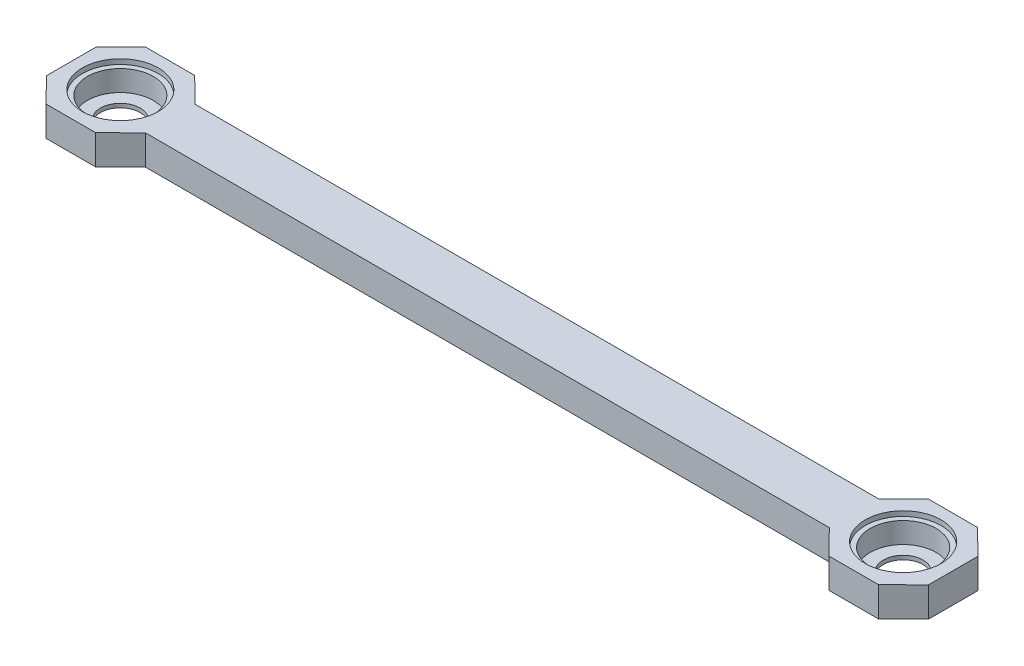
ISO-10303-21;
HEADER;
FILE_DESCRIPTION(('STEP AP214'),'2;1');
FILE_NAME('part.step','',(''),(''),'','','');
FILE_SCHEMA(('AUTOMOTIVE_DESIGN { 1 0 10303 214 1 1 1 1 }'));
ENDSEC;
DATA;
#1=APPLICATION_CONTEXT('core data for automotive mechanical design processes');
#2=APPLICATION_PROTOCOL_DEFINITION('international standard','automotive_design',2000,#1);
#3=PRODUCT_CONTEXT('',#1,'mechanical');
#4=PRODUCT('Part','Part','',(#3));
#5=PRODUCT_RELATED_PRODUCT_CATEGORY('part','',(#4));
#6=PRODUCT_DEFINITION_FORMATION('','',#4);
#7=PRODUCT_DEFINITION_CONTEXT('part definition',#1,'design');
#8=PRODUCT_DEFINITION('design','',#6,#7);
#9=PRODUCT_DEFINITION_SHAPE('','',#8);
#10=(LENGTH_UNIT() NAMED_UNIT(*) SI_UNIT(.MILLI.,.METRE.));
#11=(NAMED_UNIT(*) PLANE_ANGLE_UNIT() SI_UNIT($,.RADIAN.));
#12=(NAMED_UNIT(*) SI_UNIT($,.STERADIAN.) SOLID_ANGLE_UNIT());
#13=UNCERTAINTY_MEASURE_WITH_UNIT(LENGTH_MEASURE(1.E-05),#10,'distance_accuracy_value','');
#14=(GEOMETRIC_REPRESENTATION_CONTEXT(3) GLOBAL_UNCERTAINTY_ASSIGNED_CONTEXT((#13)) GLOBAL_UNIT_ASSIGNED_CONTEXT((#10,
#11,#12)) REPRESENTATION_CONTEXT('',''));
#15=CARTESIAN_POINT('',(0.,0.,0.));
#16=DIRECTION('',(0.,0.,1.));
#17=DIRECTION('',(1.,0.,0.));
#18=AXIS2_PLACEMENT_3D('',#15,#16,#17);
#19=CARTESIAN_POINT('',(82.6366555158427,0.8,0.));
#20=DIRECTION('',(0.,1.,0.));
#21=DIRECTION('',(0.,0.,1.));
#22=AXIS2_PLACEMENT_3D('',#19,#20,#21);
#23=CYLINDRICAL_SURFACE('',#22,6.65000000000001);
#24=CARTESIAN_POINT('',(82.6366555158427,0.8,0.));
#25=DIRECTION('',(0.,1.,0.));
#26=DIRECTION('',(0.,0.,1.));
#27=AXIS2_PLACEMENT_3D('',#24,#25,#26);
#28=CIRCLE('',#27,6.65000000000001);
#29=CARTESIAN_POINT('',(82.6366555158427,0.8,6.65000000000001));
#30=VERTEX_POINT('',#29);
#31=EDGE_CURVE('E253',#30,#30,#28,.T.);
#32=ORIENTED_EDGE('',*,*,#31,.F.);
#33=EDGE_LOOP('',(#32));
#34=FACE_BOUND('',#33,.T.);
#35=CARTESIAN_POINT('',(82.6366555158427,5.,0.));
#36=DIRECTION('',(0.,1.,0.));
#37=DIRECTION('',(0.,0.,1.));
#38=AXIS2_PLACEMENT_3D('',#35,#36,#37);
#39=CIRCLE('',#38,6.65000000000001);
#40=CARTESIAN_POINT('',(82.6366555158427,5.,6.65000000000001));
#41=VERTEX_POINT('',#40);
#42=EDGE_CURVE('E39',#41,#41,#39,.F.);
#43=ORIENTED_EDGE('',*,*,#42,.F.);
#44=EDGE_LOOP('',(#43));
#45=FACE_BOUND('',#44,.T.);
#46=ADVANCED_FACE('F35',(#34,#45),#23,.F.);
#47=CARTESIAN_POINT('',(-75.3633444841573,0.8,0.));
#48=DIRECTION('',(0.,1.,0.));
#49=DIRECTION('',(0.,0.,1.));
#50=AXIS2_PLACEMENT_3D('',#47,#48,#49);
#51=CYLINDRICAL_SURFACE('',#50,6.65000000000001);
#52=CARTESIAN_POINT('',(-75.3633444841573,0.8,0.));
#53=DIRECTION('',(0.,1.,0.));
#54=DIRECTION('',(0.,0.,1.));
#55=AXIS2_PLACEMENT_3D('',#52,#53,#54);
#56=CIRCLE('',#55,6.65000000000001);
#57=CARTESIAN_POINT('',(-75.3633444841573,0.8,6.65000000000001));
#58=VERTEX_POINT('',#57);
#59=EDGE_CURVE('E262',#58,#58,#56,.T.);
#60=ORIENTED_EDGE('',*,*,#59,.F.);
#61=EDGE_LOOP('',(#60));
#62=FACE_BOUND('',#61,.T.);
#63=CARTESIAN_POINT('',(-75.3633444841573,5.,0.));
#64=DIRECTION('',(0.,1.,0.));
#65=DIRECTION('',(0.,0.,1.));
#66=AXIS2_PLACEMENT_3D('',#63,#64,#65);
#67=CIRCLE('',#66,6.65000000000001);
#68=CARTESIAN_POINT('',(-75.3633444841573,5.,6.65000000000001));
#69=VERTEX_POINT('',#68);
#70=EDGE_CURVE('E256',#69,#69,#67,.F.);
#71=ORIENTED_EDGE('',*,*,#70,.F.);
#72=EDGE_LOOP('',(#71));
#73=FACE_BOUND('',#72,.T.);
#74=ADVANCED_FACE('F338',(#62,#73),#51,.F.);
#75=CARTESIAN_POINT('',(-75.3633444841573,6.,0.));
#76=DIRECTION('',(0.,-1.,0.));
#77=DIRECTION('',(0.,0.,-1.));
#78=AXIS2_PLACEMENT_3D('',#75,#76,#77);
#79=CYLINDRICAL_SURFACE('',#78,4.00000000000001);
#80=CARTESIAN_POINT('',(-75.3633444841573,0.,0.));
#81=DIRECTION('',(0.,1.,0.));
#82=DIRECTION('',(0.,0.,1.));
#83=AXIS2_PLACEMENT_3D('',#80,#81,#82);
#84=CIRCLE('',#83,4.00000000000001);
#85=CARTESIAN_POINT('',(-75.3633444841573,0.,4.00000000000001));
#86=VERTEX_POINT('',#85);
#87=EDGE_CURVE('E186',#86,#86,#84,.T.);
#88=ORIENTED_EDGE('',*,*,#87,.F.);
#89=EDGE_LOOP('',(#88));
#90=FACE_BOUND('',#89,.T.);
#91=CARTESIAN_POINT('',(-75.3633444841573,0.8,0.));
#92=DIRECTION('',(0.,1.,0.));
#93=DIRECTION('',(0.,0.,1.));
#94=AXIS2_PLACEMENT_3D('',#91,#92,#93);
#95=CIRCLE('',#94,4.00000000000001);
#96=CARTESIAN_POINT('',(-75.3633444841573,0.8,4.00000000000001));
#97=VERTEX_POINT('',#96);
#98=EDGE_CURVE('E252',#97,#97,#95,.T.);
#99=ORIENTED_EDGE('',*,*,#98,.T.);
#100=EDGE_LOOP('',(#99));
#101=FACE_BOUND('',#100,.T.);
#102=ADVANCED_FACE('F344',(#90,#101),#79,.F.);
#103=CARTESIAN_POINT('',(82.6366555158427,6.,0.));
#104=DIRECTION('',(0.,-1.,0.));
#105=DIRECTION('',(0.,0.,-1.));
#106=AXIS2_PLACEMENT_3D('',#103,#104,#105);
#107=CYLINDRICAL_SURFACE('',#106,4.00000000000001);
#108=CARTESIAN_POINT('',(82.6366555158427,0.,0.));
#109=DIRECTION('',(0.,1.,0.));
#110=DIRECTION('',(0.,0.,1.));
#111=AXIS2_PLACEMENT_3D('',#108,#109,#110);
#112=CIRCLE('',#111,4.00000000000001);
#113=CARTESIAN_POINT('',(82.6366555158427,0.,4.00000000000001));
#114=VERTEX_POINT('',#113);
#115=EDGE_CURVE('E255',#114,#114,#112,.T.);
#116=ORIENTED_EDGE('',*,*,#115,.F.);
#117=EDGE_LOOP('',(#116));
#118=FACE_BOUND('',#117,.T.);
#119=CARTESIAN_POINT('',(82.6366555158427,0.8,0.));
#120=DIRECTION('',(0.,1.,0.));
#121=DIRECTION('',(0.,0.,1.));
#122=AXIS2_PLACEMENT_3D('',#119,#120,#121);
#123=CIRCLE('',#122,4.00000000000001);
#124=CARTESIAN_POINT('',(82.6366555158427,0.8,4.00000000000001));
#125=VERTEX_POINT('',#124);
#126=EDGE_CURVE('E249',#125,#125,#123,.T.);
#127=ORIENTED_EDGE('',*,*,#126,.T.);
#128=EDGE_LOOP('',(#127));
#129=FACE_BOUND('',#128,.T.);
#130=ADVANCED_FACE('F355',(#118,#129),#107,.F.);
#131=CARTESIAN_POINT('',(0.,6.,0.));
#132=DIRECTION('',(0.,-1.,0.));
#133=DIRECTION('',(0.,0.,-1.));
#134=AXIS2_PLACEMENT_3D('',#131,#132,#133);
#135=PLANE('',#134);
#136=CARTESIAN_POINT('',(82.6366555158427,6.,0.));
#137=DIRECTION('',(0.,1.,0.));
#138=DIRECTION('',(0.,0.,1.));
#139=AXIS2_PLACEMENT_3D('',#136,#137,#138);
#140=CIRCLE('',#139,7.65);
#141=CARTESIAN_POINT('',(82.6366555158427,6.,7.65));
#142=VERTEX_POINT('',#141);
#143=EDGE_CURVE('E264',#142,#142,#140,.T.);
#144=ORIENTED_EDGE('',*,*,#143,.F.);
#145=EDGE_LOOP('',(#144));
#146=FACE_BOUND('',#145,.T.);
#147=CARTESIAN_POINT('',(-75.3633444841573,6.,0.));
#148=DIRECTION('',(0.,1.,0.));
#149=DIRECTION('',(0.,0.,1.));
#150=AXIS2_PLACEMENT_3D('',#147,#148,#149);
#151=CIRCLE('',#150,7.65);
#152=CARTESIAN_POINT('',(-75.3633444841573,6.,7.65));
#153=VERTEX_POINT('',#152);
#154=EDGE_CURVE('E274',#153,#153,#151,.T.);
#155=ORIENTED_EDGE('',*,*,#154,.F.);
#156=EDGE_LOOP('',(#155));
#157=FACE_BOUND('',#156,.T.);
#158=DIRECTION('',(-1.,0.,0.));
#159=VECTOR('',#158,1.);
#160=CARTESIAN_POINT('',(-65.2623239697237,6.,-5.));
#161=LINE('',#160,#159);
#162=CARTESIAN_POINT('',(72.7376760302763,6.,-5.));
#163=VERTEX_POINT('',#162);
#164=CARTESIAN_POINT('',(-65.2623239697237,6.,-5.));
#165=VERTEX_POINT('',#164);
#166=EDGE_CURVE('E213',#163,#165,#161,.T.);
#167=ORIENTED_EDGE('',*,*,#166,.T.);
#168=DIRECTION('',(-0.714142857145833,0.,-0.699999985419705));
#169=VECTOR('',#168,1.);
#170=CARTESIAN_POINT('',(-65.2623239697237,6.,-5.));
#171=LINE('',#170,#169);
#172=CARTESIAN_POINT('',(-70.3633444841573,6.,-10.));
#173=VERTEX_POINT('',#172);
#174=EDGE_CURVE('E121',#165,#173,#171,.T.);
#175=ORIENTED_EDGE('',*,*,#174,.T.);
#176=DIRECTION('',(-1.,0.,0.));
#177=VECTOR('',#176,1.);
#178=CARTESIAN_POINT('',(-70.3633444841573,6.,-10.));
#179=LINE('',#178,#177);
#180=CARTESIAN_POINT('',(-80.3633444841573,6.,-10.));
#181=VERTEX_POINT('',#180);
#182=EDGE_CURVE('E287',#173,#181,#179,.T.);
#183=ORIENTED_EDGE('',*,*,#182,.T.);
#184=DIRECTION('',(-0.699854212223766,0.,0.714285714285714));
#185=VECTOR('',#184,1.);
#186=CARTESIAN_POINT('',(-80.3633444841573,6.,-10.));
#187=LINE('',#186,#185);
#188=CARTESIAN_POINT('',(-85.2623239697237,6.,-5.));
#189=VERTEX_POINT('',#188);
#190=EDGE_CURVE('E289',#181,#189,#187,.T.);
#191=ORIENTED_EDGE('',*,*,#190,.T.);
#192=DIRECTION('',(0.,0.,1.));
#193=VECTOR('',#192,1.);
#194=CARTESIAN_POINT('',(-85.2623239697237,6.,-5.));
#195=LINE('',#194,#193);
#196=CARTESIAN_POINT('',(-85.2623239697237,6.,5.));
#197=VERTEX_POINT('',#196);
#198=EDGE_CURVE('E291',#189,#197,#195,.T.);
#199=ORIENTED_EDGE('',*,*,#198,.T.);
#200=DIRECTION('',(0.699854212223765,0.,0.714285714285715));
#201=VECTOR('',#200,1.);
#202=CARTESIAN_POINT('',(-80.3633444841573,6.,10.));
#203=LINE('',#202,#201);
#204=CARTESIAN_POINT('',(-80.3633444841573,6.,10.));
#205=VERTEX_POINT('',#204);
#206=EDGE_CURVE('E293',#197,#205,#203,.T.);
#207=ORIENTED_EDGE('',*,*,#206,.T.);
#208=DIRECTION('',(1.,0.,0.));
#209=VECTOR('',#208,1.);
#210=CARTESIAN_POINT('',(-70.3633444841573,6.,10.));
#211=LINE('',#210,#209);
#212=CARTESIAN_POINT('',(-70.3633444841573,6.,10.));
#213=VERTEX_POINT('',#212);
#214=EDGE_CURVE('E295',#205,#213,#211,.T.);
#215=ORIENTED_EDGE('',*,*,#214,.T.);
#216=DIRECTION('',(0.714142857145833,0.,-0.699999985419705));
#217=VECTOR('',#216,1.);
#218=CARTESIAN_POINT('',(-65.2623239697237,6.,5.));
#219=LINE('',#218,#217);
#220=CARTESIAN_POINT('',(-65.2623239697237,6.,5.));
#221=VERTEX_POINT('',#220);
#222=EDGE_CURVE('E297',#213,#221,#219,.T.);
#223=ORIENTED_EDGE('',*,*,#222,.T.);
#224=DIRECTION('',(1.,0.,0.));
#225=VECTOR('',#224,1.);
#226=CARTESIAN_POINT('',(72.7376760302763,6.,5.));
#227=LINE('',#226,#225);
#228=CARTESIAN_POINT('',(72.7376760302763,6.,5.));
#229=VERTEX_POINT('',#228);
#230=EDGE_CURVE('E299',#221,#229,#227,.T.);
#231=ORIENTED_EDGE('',*,*,#230,.T.);
#232=DIRECTION('',(0.699854212223766,0.,0.714285714285714));
#233=VECTOR('',#232,1.);
#234=CARTESIAN_POINT('',(72.7376760302763,6.,5.));
#235=LINE('',#234,#233);
#236=CARTESIAN_POINT('',(77.6366555158427,6.,10.));
#237=VERTEX_POINT('',#236);
#238=EDGE_CURVE('E301',#229,#237,#235,.T.);
#239=ORIENTED_EDGE('',*,*,#238,.T.);
#240=DIRECTION('',(1.,0.,0.));
#241=VECTOR('',#240,1.);
#242=CARTESIAN_POINT('',(77.6366555158427,6.,10.));
#243=LINE('',#242,#241);
#244=CARTESIAN_POINT('',(87.6366555158427,6.,10.));
#245=VERTEX_POINT('',#244);
#246=EDGE_CURVE('E303',#237,#245,#243,.T.);
#247=ORIENTED_EDGE('',*,*,#246,.T.);
#248=DIRECTION('',(0.714285714285714,0.,-0.699854212223765));
#249=VECTOR('',#248,1.);
#250=CARTESIAN_POINT('',(87.6366555158427,6.,10.));
#251=LINE('',#250,#249);
#252=CARTESIAN_POINT('',(92.739759146641,6.,5.));
#253=VERTEX_POINT('',#252);
#254=EDGE_CURVE('E305',#245,#253,#251,.T.);
#255=ORIENTED_EDGE('',*,*,#254,.T.);
#256=DIRECTION('',(0.,0.,-1.));
#257=VECTOR('',#256,1.);
#258=CARTESIAN_POINT('',(92.739759146641,6.,-5.));
#259=LINE('',#258,#257);
#260=CARTESIAN_POINT('',(92.739759146641,6.,-5.));
#261=VERTEX_POINT('',#260);
#262=EDGE_CURVE('E164',#253,#261,#259,.T.);
#263=ORIENTED_EDGE('',*,*,#262,.T.);
#264=DIRECTION('',(-0.714285714285714,0.,-0.699854212223765));
#265=VECTOR('',#264,1.);
#266=CARTESIAN_POINT('',(87.6366555158427,6.,-10.));
#267=LINE('',#266,#265);
#268=CARTESIAN_POINT('',(87.6366555158427,6.,-10.));
#269=VERTEX_POINT('',#268);
#270=EDGE_CURVE('E158',#261,#269,#267,.T.);
#271=ORIENTED_EDGE('',*,*,#270,.T.);
#272=DIRECTION('',(-1.,0.,0.));
#273=VECTOR('',#272,1.);
#274=CARTESIAN_POINT('',(77.6366555158427,6.,-10.));
#275=LINE('',#274,#273);
#276=CARTESIAN_POINT('',(77.6366555158427,6.,-10.));
#277=VERTEX_POINT('',#276);
#278=EDGE_CURVE('E162',#269,#277,#275,.T.);
#279=ORIENTED_EDGE('',*,*,#278,.T.);
#280=DIRECTION('',(-0.699854212223766,0.,0.714285714285714));
#281=VECTOR('',#280,1.);
#282=CARTESIAN_POINT('',(72.7376760302763,6.,-5.));
#283=LINE('',#282,#281);
#284=EDGE_CURVE('E54',#277,#163,#283,.T.);
#285=ORIENTED_EDGE('',*,*,#284,.T.);
#286=EDGE_LOOP('',(#167,#175,#183,#191,#199,#207,#215,#223,#231,#239,#247,#255,#263,#271,#279,#285));
#287=FACE_BOUND('',#286,.T.);
#288=ADVANCED_FACE('F160',(#146,#157,#287),#135,.F.);
#289=CARTESIAN_POINT('',(0.,0.,0.));
#290=DIRECTION('',(0.,-1.,0.));
#291=DIRECTION('',(0.,0.,-1.));
#292=AXIS2_PLACEMENT_3D('',#289,#290,#291);
#293=PLANE('',#292);
#294=ORIENTED_EDGE('',*,*,#87,.T.);
#295=EDGE_LOOP('',(#294));
#296=FACE_BOUND('',#295,.T.);
#297=DIRECTION('',(-1.,0.,0.));
#298=VECTOR('',#297,1.);
#299=CARTESIAN_POINT('',(-65.2623239697237,0.,-5.));
#300=LINE('',#299,#298);
#301=CARTESIAN_POINT('',(72.7376760302763,0.,-5.));
#302=VERTEX_POINT('',#301);
#303=CARTESIAN_POINT('',(-65.2623239697237,0.,-5.));
#304=VERTEX_POINT('',#303);
#305=EDGE_CURVE('E182',#302,#304,#300,.T.);
#306=ORIENTED_EDGE('',*,*,#305,.F.);
#307=DIRECTION('',(-0.699854212223766,0.,0.714285714285714));
#308=VECTOR('',#307,1.);
#309=CARTESIAN_POINT('',(72.7376760302763,0.,-5.));
#310=LINE('',#309,#308);
#311=CARTESIAN_POINT('',(77.6366555158427,0.,-10.));
#312=VERTEX_POINT('',#311);
#313=EDGE_CURVE('E113',#312,#302,#310,.T.);
#314=ORIENTED_EDGE('',*,*,#313,.F.);
#315=DIRECTION('',(-1.,0.,0.));
#316=VECTOR('',#315,1.);
#317=CARTESIAN_POINT('',(77.6366555158427,0.,-10.));
#318=LINE('',#317,#316);
#319=CARTESIAN_POINT('',(87.6366555158427,0.,-10.));
#320=VERTEX_POINT('',#319);
#321=EDGE_CURVE('E107',#320,#312,#318,.T.);
#322=ORIENTED_EDGE('',*,*,#321,.F.);
#323=DIRECTION('',(-0.714285714285714,0.,-0.699854212223765));
#324=VECTOR('',#323,1.);
#325=CARTESIAN_POINT('',(87.6366555158427,0.,-10.));
#326=LINE('',#325,#324);
#327=CARTESIAN_POINT('',(92.739759146641,0.,-5.));
#328=VERTEX_POINT('',#327);
#329=EDGE_CURVE('E172',#328,#320,#326,.T.);
#330=ORIENTED_EDGE('',*,*,#329,.F.);
#331=DIRECTION('',(0.,0.,-1.));
#332=VECTOR('',#331,1.);
#333=CARTESIAN_POINT('',(92.739759146641,0.,-5.));
#334=LINE('',#333,#332);
#335=CARTESIAN_POINT('',(92.739759146641,0.,5.));
#336=VERTEX_POINT('',#335);
#337=EDGE_CURVE('E208',#336,#328,#334,.T.);
#338=ORIENTED_EDGE('',*,*,#337,.F.);
#339=DIRECTION('',(0.714285714285714,0.,-0.699854212223765));
#340=VECTOR('',#339,1.);
#341=CARTESIAN_POINT('',(87.6366555158427,0.,10.));
#342=LINE('',#341,#340);
#343=CARTESIAN_POINT('',(87.6366555158427,0.,10.));
#344=VERTEX_POINT('',#343);
#345=EDGE_CURVE('E206',#344,#336,#342,.T.);
#346=ORIENTED_EDGE('',*,*,#345,.F.);
#347=DIRECTION('',(1.,0.,0.));
#348=VECTOR('',#347,1.);
#349=CARTESIAN_POINT('',(77.6366555158427,0.,10.));
#350=LINE('',#349,#348);
#351=CARTESIAN_POINT('',(77.6366555158427,0.,10.));
#352=VERTEX_POINT('',#351);
#353=EDGE_CURVE('E204',#352,#344,#350,.T.);
#354=ORIENTED_EDGE('',*,*,#353,.F.);
#355=DIRECTION('',(0.699854212223766,0.,0.714285714285714));
#356=VECTOR('',#355,1.);
#357=CARTESIAN_POINT('',(72.7376760302763,0.,5.));
#358=LINE('',#357,#356);
#359=CARTESIAN_POINT('',(72.7376760302763,0.,5.));
#360=VERTEX_POINT('',#359);
#361=EDGE_CURVE('E202',#360,#352,#358,.T.);
#362=ORIENTED_EDGE('',*,*,#361,.F.);
#363=DIRECTION('',(1.,0.,0.));
#364=VECTOR('',#363,1.);
#365=CARTESIAN_POINT('',(72.7376760302763,0.,5.));
#366=LINE('',#365,#364);
#367=CARTESIAN_POINT('',(-65.2623239697237,0.,5.));
#368=VERTEX_POINT('',#367);
#369=EDGE_CURVE('E200',#368,#360,#366,.T.);
#370=ORIENTED_EDGE('',*,*,#369,.F.);
#371=DIRECTION('',(0.714142857145833,0.,-0.699999985419705));
#372=VECTOR('',#371,1.);
#373=CARTESIAN_POINT('',(-65.2623239697237,0.,5.));
#374=LINE('',#373,#372);
#375=CARTESIAN_POINT('',(-70.3633444841573,0.,10.));
#376=VERTEX_POINT('',#375);
#377=EDGE_CURVE('E198',#376,#368,#374,.T.);
#378=ORIENTED_EDGE('',*,*,#377,.F.);
#379=DIRECTION('',(1.,0.,0.));
#380=VECTOR('',#379,1.);
#381=CARTESIAN_POINT('',(-70.3633444841573,0.,10.));
#382=LINE('',#381,#380);
#383=CARTESIAN_POINT('',(-80.3633444841573,0.,10.));
#384=VERTEX_POINT('',#383);
#385=EDGE_CURVE('E196',#384,#376,#382,.T.);
#386=ORIENTED_EDGE('',*,*,#385,.F.);
#387=DIRECTION('',(0.699854212223765,0.,0.714285714285715));
#388=VECTOR('',#387,1.);
#389=CARTESIAN_POINT('',(-80.3633444841573,0.,10.));
#390=LINE('',#389,#388);
#391=CARTESIAN_POINT('',(-85.2623239697237,0.,5.));
#392=VERTEX_POINT('',#391);
#393=EDGE_CURVE('E194',#392,#384,#390,.T.);
#394=ORIENTED_EDGE('',*,*,#393,.F.);
#395=DIRECTION('',(0.,0.,1.));
#396=VECTOR('',#395,1.);
#397=CARTESIAN_POINT('',(-85.2623239697237,0.,-5.));
#398=LINE('',#397,#396);
#399=CARTESIAN_POINT('',(-85.2623239697237,0.,-5.));
#400=VERTEX_POINT('',#399);
#401=EDGE_CURVE('E192',#400,#392,#398,.T.);
#402=ORIENTED_EDGE('',*,*,#401,.F.);
#403=DIRECTION('',(-0.699854212223766,0.,0.714285714285714));
#404=VECTOR('',#403,1.);
#405=CARTESIAN_POINT('',(-80.3633444841573,0.,-10.));
#406=LINE('',#405,#404);
#407=CARTESIAN_POINT('',(-80.3633444841573,0.,-10.));
#408=VERTEX_POINT('',#407);
#409=EDGE_CURVE('E190',#408,#400,#406,.T.);
#410=ORIENTED_EDGE('',*,*,#409,.F.);
#411=DIRECTION('',(-1.,0.,0.));
#412=VECTOR('',#411,1.);
#413=CARTESIAN_POINT('',(-70.3633444841573,0.,-10.));
#414=LINE('',#413,#412);
#415=CARTESIAN_POINT('',(-70.3633444841573,0.,-10.));
#416=VERTEX_POINT('',#415);
#417=EDGE_CURVE('E188',#416,#408,#414,.T.);
#418=ORIENTED_EDGE('',*,*,#417,.F.);
#419=DIRECTION('',(-0.714142857145833,0.,-0.699999985419705));
#420=VECTOR('',#419,1.);
#421=CARTESIAN_POINT('',(-65.2623239697237,0.,-5.));
#422=LINE('',#421,#420);
#423=EDGE_CURVE('E185',#304,#416,#422,.T.);
#424=ORIENTED_EDGE('',*,*,#423,.F.);
#425=EDGE_LOOP('',(#306,#314,#322,#330,#338,#346,#354,#362,#370,#378,#386,#394,#402,#410,#418,#424));
#426=FACE_BOUND('',#425,.T.);
#427=ORIENTED_EDGE('',*,*,#115,.T.);
#428=EDGE_LOOP('',(#427));
#429=FACE_BOUND('',#428,.T.);
#430=ADVANCED_FACE('F318',(#296,#426,#429),#293,.T.);
#431=CARTESIAN_POINT('',(-65.2623239697237,6.,-5.));
#432=DIRECTION('',(0.,0.,1.));
#433=DIRECTION('',(1.,0.,0.));
#434=AXIS2_PLACEMENT_3D('',#431,#432,#433);
#435=PLANE('',#434);
#436=ORIENTED_EDGE('',*,*,#305,.T.);
#437=DIRECTION('',(0.,-1.,0.));
#438=VECTOR('',#437,1.);
#439=CARTESIAN_POINT('',(-65.2623239697237,6.,-5.));
#440=LINE('',#439,#438);
#441=EDGE_CURVE('E11',#165,#304,#440,.T.);
#442=ORIENTED_EDGE('',*,*,#441,.F.);
#443=ORIENTED_EDGE('',*,*,#166,.F.);
#444=DIRECTION('',(0.,-1.,0.));
#445=VECTOR('',#444,1.);
#446=CARTESIAN_POINT('',(72.7376760302763,6.,-5.));
#447=LINE('',#446,#445);
#448=EDGE_CURVE('E178',#163,#302,#447,.T.);
#449=ORIENTED_EDGE('',*,*,#448,.T.);
#450=EDGE_LOOP('',(#436,#442,#443,#449));
#451=FACE_BOUND('',#450,.T.);
#452=ADVANCED_FACE('F37',(#451),#435,.F.);
#453=CARTESIAN_POINT('',(-65.2623239697237,6.,-5.));
#454=DIRECTION('',(-0.699999985419705,0.,0.714142857145833));
#455=DIRECTION('',(0.714142857145833,0.,0.699999985419705));
#456=AXIS2_PLACEMENT_3D('',#453,#454,#455);
#457=PLANE('',#456);
#458=ORIENTED_EDGE('',*,*,#423,.T.);
#459=DIRECTION('',(0.,-1.,0.));
#460=VECTOR('',#459,1.);
#461=CARTESIAN_POINT('',(-70.3633444841573,6.,-10.));
#462=LINE('',#461,#460);
#463=EDGE_CURVE('E45',#173,#416,#462,.T.);
#464=ORIENTED_EDGE('',*,*,#463,.F.);
#465=ORIENTED_EDGE('',*,*,#174,.F.);
#466=ORIENTED_EDGE('',*,*,#441,.T.);
#467=EDGE_LOOP('',(#458,#464,#465,#466));
#468=FACE_BOUND('',#467,.T.);
#469=ADVANCED_FACE('F369',(#468),#457,.F.);
#470=CARTESIAN_POINT('',(-70.3633444841573,6.,-10.));
#471=DIRECTION('',(0.,0.,1.));
#472=DIRECTION('',(1.,0.,0.));
#473=AXIS2_PLACEMENT_3D('',#470,#471,#472);
#474=PLANE('',#473);
#475=ORIENTED_EDGE('',*,*,#417,.T.);
#476=DIRECTION('',(0.,-1.,0.));
#477=VECTOR('',#476,1.);
#478=CARTESIAN_POINT('',(-80.3633444841573,6.,-10.));
#479=LINE('',#478,#477);
#480=EDGE_CURVE('E244',#181,#408,#479,.T.);
#481=ORIENTED_EDGE('',*,*,#480,.F.);
#482=ORIENTED_EDGE('',*,*,#182,.F.);
#483=ORIENTED_EDGE('',*,*,#463,.T.);
#484=EDGE_LOOP('',(#475,#481,#482,#483));
#485=FACE_BOUND('',#484,.T.);
#486=ADVANCED_FACE('F379',(#485),#474,.F.);
#487=CARTESIAN_POINT('',(-80.3633444841573,6.,-10.));
#488=DIRECTION('',(0.714285714285714,0.,0.699854212223766));
#489=DIRECTION('',(0.699854212223766,0.,-0.714285714285714));
#490=AXIS2_PLACEMENT_3D('',#487,#488,#489);
#491=PLANE('',#490);
#492=ORIENTED_EDGE('',*,*,#409,.T.);
#493=DIRECTION('',(0.,-1.,0.));
#494=VECTOR('',#493,1.);
#495=CARTESIAN_POINT('',(-85.2623239697237,6.,-5.));
#496=LINE('',#495,#494);
#497=EDGE_CURVE('E241',#189,#400,#496,.T.);
#498=ORIENTED_EDGE('',*,*,#497,.F.);
#499=ORIENTED_EDGE('',*,*,#190,.F.);
#500=ORIENTED_EDGE('',*,*,#480,.T.);
#501=EDGE_LOOP('',(#492,#498,#499,#500));
#502=FACE_BOUND('',#501,.T.);
#503=ADVANCED_FACE('F383',(#502),#491,.F.);
#504=CARTESIAN_POINT('',(-85.2623239697237,6.,-5.));
#505=DIRECTION('',(1.,0.,0.));
#506=DIRECTION('',(0.,0.,-1.));
#507=AXIS2_PLACEMENT_3D('',#504,#505,#506);
#508=PLANE('',#507);
#509=ORIENTED_EDGE('',*,*,#401,.T.);
#510=DIRECTION('',(0.,-1.,0.));
#511=VECTOR('',#510,1.);
#512=CARTESIAN_POINT('',(-85.2623239697237,6.,5.));
#513=LINE('',#512,#511);
#514=EDGE_CURVE('E238',#197,#392,#513,.T.);
#515=ORIENTED_EDGE('',*,*,#514,.F.);
#516=ORIENTED_EDGE('',*,*,#198,.F.);
#517=ORIENTED_EDGE('',*,*,#497,.T.);
#518=EDGE_LOOP('',(#509,#515,#516,#517));
#519=FACE_BOUND('',#518,.T.);
#520=ADVANCED_FACE('F389',(#519),#508,.F.);
#521=CARTESIAN_POINT('',(-80.3633444841573,6.,10.));
#522=DIRECTION('',(0.714285714285715,0.,-0.699854212223764));
#523=DIRECTION('',(-0.699854212223764,0.,-0.714285714285715));
#524=AXIS2_PLACEMENT_3D('',#521,#522,#523);
#525=PLANE('',#524);
#526=ORIENTED_EDGE('',*,*,#393,.T.);
#527=DIRECTION('',(0.,-1.,0.));
#528=VECTOR('',#527,1.);
#529=CARTESIAN_POINT('',(-80.3633444841573,6.,10.));
#530=LINE('',#529,#528);
#531=EDGE_CURVE('E235',#205,#384,#530,.T.);
#532=ORIENTED_EDGE('',*,*,#531,.F.);
#533=ORIENTED_EDGE('',*,*,#206,.F.);
#534=ORIENTED_EDGE('',*,*,#514,.T.);
#535=EDGE_LOOP('',(#526,#532,#533,#534));
#536=FACE_BOUND('',#535,.T.);
#537=ADVANCED_FACE('F393',(#536),#525,.F.);
#538=CARTESIAN_POINT('',(-70.3633444841573,6.,10.));
#539=DIRECTION('',(0.,0.,-1.));
#540=DIRECTION('',(-1.,0.,0.));
#541=AXIS2_PLACEMENT_3D('',#538,#539,#540);
#542=PLANE('',#541);
#543=ORIENTED_EDGE('',*,*,#385,.T.);
#544=DIRECTION('',(0.,-1.,0.));
#545=VECTOR('',#544,1.);
#546=CARTESIAN_POINT('',(-70.3633444841573,6.,10.));
#547=LINE('',#546,#545);
#548=EDGE_CURVE('E232',#213,#376,#547,.T.);
#549=ORIENTED_EDGE('',*,*,#548,.F.);
#550=ORIENTED_EDGE('',*,*,#214,.F.);
#551=ORIENTED_EDGE('',*,*,#531,.T.);
#552=EDGE_LOOP('',(#543,#549,#550,#551));
#553=FACE_BOUND('',#552,.T.);
#554=ADVANCED_FACE('F397',(#553),#542,.F.);
#555=CARTESIAN_POINT('',(-65.2623239697237,6.,5.));
#556=DIRECTION('',(-0.699999985419705,0.,-0.714142857145833));
#557=DIRECTION('',(-0.714142857145833,0.,0.699999985419705));
#558=AXIS2_PLACEMENT_3D('',#555,#556,#557);
#559=PLANE('',#558);
#560=ORIENTED_EDGE('',*,*,#377,.T.);
#561=DIRECTION('',(0.,-1.,0.));
#562=VECTOR('',#561,1.);
#563=CARTESIAN_POINT('',(-65.2623239697237,6.,5.));
#564=LINE('',#563,#562);
#565=EDGE_CURVE('E229',#221,#368,#564,.T.);
#566=ORIENTED_EDGE('',*,*,#565,.F.);
#567=ORIENTED_EDGE('',*,*,#222,.F.);
#568=ORIENTED_EDGE('',*,*,#548,.T.);
#569=EDGE_LOOP('',(#560,#566,#567,#568));
#570=FACE_BOUND('',#569,.T.);
#571=ADVANCED_FACE('F401',(#570),#559,.F.);
#572=CARTESIAN_POINT('',(72.7376760302763,6.,5.));
#573=DIRECTION('',(0.,0.,-1.));
#574=DIRECTION('',(-1.,0.,0.));
#575=AXIS2_PLACEMENT_3D('',#572,#573,#574);
#576=PLANE('',#575);
#577=ORIENTED_EDGE('',*,*,#369,.T.);
#578=DIRECTION('',(0.,-1.,0.));
#579=VECTOR('',#578,1.);
#580=CARTESIAN_POINT('',(72.7376760302763,6.,5.));
#581=LINE('',#580,#579);
#582=EDGE_CURVE('E226',#229,#360,#581,.T.);
#583=ORIENTED_EDGE('',*,*,#582,.F.);
#584=ORIENTED_EDGE('',*,*,#230,.F.);
#585=ORIENTED_EDGE('',*,*,#565,.T.);
#586=EDGE_LOOP('',(#577,#583,#584,#585));
#587=FACE_BOUND('',#586,.T.);
#588=ADVANCED_FACE('F405',(#587),#576,.F.);
#589=CARTESIAN_POINT('',(72.7376760302763,6.,5.));
#590=DIRECTION('',(0.714285714285714,0.,-0.699854212223766));
#591=DIRECTION('',(-0.699854212223766,0.,-0.714285714285714));
#592=AXIS2_PLACEMENT_3D('',#589,#590,#591);
#593=PLANE('',#592);
#594=ORIENTED_EDGE('',*,*,#361,.T.);
#595=DIRECTION('',(0.,-1.,0.));
#596=VECTOR('',#595,1.);
#597=CARTESIAN_POINT('',(77.6366555158427,6.,10.));
#598=LINE('',#597,#596);
#599=EDGE_CURVE('E223',#237,#352,#598,.T.);
#600=ORIENTED_EDGE('',*,*,#599,.F.);
#601=ORIENTED_EDGE('',*,*,#238,.F.);
#602=ORIENTED_EDGE('',*,*,#582,.T.);
#603=EDGE_LOOP('',(#594,#600,#601,#602));
#604=FACE_BOUND('',#603,.T.);
#605=ADVANCED_FACE('F409',(#604),#593,.F.);
#606=CARTESIAN_POINT('',(77.6366555158427,6.,10.));
#607=DIRECTION('',(0.,0.,-1.));
#608=DIRECTION('',(-1.,0.,0.));
#609=AXIS2_PLACEMENT_3D('',#606,#607,#608);
#610=PLANE('',#609);
#611=ORIENTED_EDGE('',*,*,#353,.T.);
#612=DIRECTION('',(0.,-1.,0.));
#613=VECTOR('',#612,1.);
#614=CARTESIAN_POINT('',(87.6366555158427,6.,10.));
#615=LINE('',#614,#613);
#616=EDGE_CURVE('E220',#245,#344,#615,.T.);
#617=ORIENTED_EDGE('',*,*,#616,.F.);
#618=ORIENTED_EDGE('',*,*,#246,.F.);
#619=ORIENTED_EDGE('',*,*,#599,.T.);
#620=EDGE_LOOP('',(#611,#617,#618,#619));
#621=FACE_BOUND('',#620,.T.);
#622=ADVANCED_FACE('F413',(#621),#610,.F.);
#623=CARTESIAN_POINT('',(87.6366555158427,6.,10.));
#624=DIRECTION('',(-0.699854212223765,0.,-0.714285714285714));
#625=DIRECTION('',(-0.714285714285714,0.,0.699854212223765));
#626=AXIS2_PLACEMENT_3D('',#623,#624,#625);
#627=PLANE('',#626);
#628=ORIENTED_EDGE('',*,*,#345,.T.);
#629=DIRECTION('',(0.,-1.,0.));
#630=VECTOR('',#629,1.);
#631=CARTESIAN_POINT('',(92.739759146641,6.,5.));
#632=LINE('',#631,#630);
#633=EDGE_CURVE('E217',#253,#336,#632,.T.);
#634=ORIENTED_EDGE('',*,*,#633,.F.);
#635=ORIENTED_EDGE('',*,*,#254,.F.);
#636=ORIENTED_EDGE('',*,*,#616,.T.);
#637=EDGE_LOOP('',(#628,#634,#635,#636));
#638=FACE_BOUND('',#637,.T.);
#639=ADVANCED_FACE('F311',(#638),#627,.F.);
#640=CARTESIAN_POINT('',(92.739759146641,6.,-5.));
#641=DIRECTION('',(-1.,0.,0.));
#642=DIRECTION('',(0.,0.,1.));
#643=AXIS2_PLACEMENT_3D('',#640,#641,#642);
#644=PLANE('',#643);
#645=ORIENTED_EDGE('',*,*,#337,.T.);
#646=DIRECTION('',(0.,-1.,0.));
#647=VECTOR('',#646,1.);
#648=CARTESIAN_POINT('',(92.739759146641,6.,-5.));
#649=LINE('',#648,#647);
#650=EDGE_CURVE('E173',#261,#328,#649,.T.);
#651=ORIENTED_EDGE('',*,*,#650,.F.);
#652=ORIENTED_EDGE('',*,*,#262,.F.);
#653=ORIENTED_EDGE('',*,*,#633,.T.);
#654=EDGE_LOOP('',(#645,#651,#652,#653));
#655=FACE_BOUND('',#654,.T.);
#656=ADVANCED_FACE('F315',(#655),#644,.F.);
#657=CARTESIAN_POINT('',(87.6366555158427,6.,-10.));
#658=DIRECTION('',(-0.699854212223765,0.,0.714285714285714));
#659=DIRECTION('',(0.714285714285714,0.,0.699854212223765));
#660=AXIS2_PLACEMENT_3D('',#657,#658,#659);
#661=PLANE('',#660);
#662=ORIENTED_EDGE('',*,*,#329,.T.);
#663=DIRECTION('',(0.,-1.,0.));
#664=VECTOR('',#663,1.);
#665=CARTESIAN_POINT('',(87.6366555158427,6.,-10.));
#666=LINE('',#665,#664);
#667=EDGE_CURVE('E169',#269,#320,#666,.T.);
#668=ORIENTED_EDGE('',*,*,#667,.F.);
#669=ORIENTED_EDGE('',*,*,#270,.F.);
#670=ORIENTED_EDGE('',*,*,#650,.T.);
#671=EDGE_LOOP('',(#662,#668,#669,#670));
#672=FACE_BOUND('',#671,.T.);
#673=ADVANCED_FACE('F170',(#672),#661,.F.);
#674=CARTESIAN_POINT('',(77.6366555158427,6.,-10.));
#675=DIRECTION('',(0.,0.,1.));
#676=DIRECTION('',(1.,0.,0.));
#677=AXIS2_PLACEMENT_3D('',#674,#675,#676);
#678=PLANE('',#677);
#679=ORIENTED_EDGE('',*,*,#321,.T.);
#680=DIRECTION('',(0.,-1.,0.));
#681=VECTOR('',#680,1.);
#682=CARTESIAN_POINT('',(77.6366555158427,6.,-10.));
#683=LINE('',#682,#681);
#684=EDGE_CURVE('E174',#277,#312,#683,.T.);
#685=ORIENTED_EDGE('',*,*,#684,.F.);
#686=ORIENTED_EDGE('',*,*,#278,.F.);
#687=ORIENTED_EDGE('',*,*,#667,.T.);
#688=EDGE_LOOP('',(#679,#685,#686,#687));
#689=FACE_BOUND('',#688,.T.);
#690=ADVANCED_FACE('F176',(#689),#678,.F.);
#691=CARTESIAN_POINT('',(72.7376760302763,6.,-5.));
#692=DIRECTION('',(0.714285714285713,0.,0.699854212223766));
#693=DIRECTION('',(0.699854212223766,0.,-0.714285714285714));
#694=AXIS2_PLACEMENT_3D('',#691,#692,#693);
#695=PLANE('',#694);
#696=ORIENTED_EDGE('',*,*,#313,.T.);
#697=ORIENTED_EDGE('',*,*,#448,.F.);
#698=ORIENTED_EDGE('',*,*,#284,.F.);
#699=ORIENTED_EDGE('',*,*,#684,.T.);
#700=EDGE_LOOP('',(#696,#697,#698,#699));
#701=FACE_BOUND('',#700,.T.);
#702=ADVANCED_FACE('F324',(#701),#695,.F.);
#703=CARTESIAN_POINT('',(82.6366555158427,0.8,0.));
#704=DIRECTION('',(0.,1.,0.));
#705=DIRECTION('',(0.,0.,1.));
#706=AXIS2_PLACEMENT_3D('',#703,#704,#705);
#707=PLANE('',#706);
#708=ORIENTED_EDGE('',*,*,#126,.F.);
#709=EDGE_LOOP('',(#708));
#710=FACE_BOUND('',#709,.T.);
#711=ORIENTED_EDGE('',*,*,#31,.T.);
#712=EDGE_LOOP('',(#711));
#713=FACE_BOUND('',#712,.T.);
#714=ADVANCED_FACE('F326',(#710,#713),#707,.T.);
#715=CARTESIAN_POINT('',(-75.3633444841573,0.8,0.));
#716=DIRECTION('',(0.,1.,0.));
#717=DIRECTION('',(0.,0.,1.));
#718=AXIS2_PLACEMENT_3D('',#715,#716,#717);
#719=PLANE('',#718);
#720=ORIENTED_EDGE('',*,*,#98,.F.);
#721=EDGE_LOOP('',(#720));
#722=FACE_BOUND('',#721,.T.);
#723=ORIENTED_EDGE('',*,*,#59,.T.);
#724=EDGE_LOOP('',(#723));
#725=FACE_BOUND('',#724,.T.);
#726=ADVANCED_FACE('F332',(#722,#725),#719,.T.);
#727=CARTESIAN_POINT('',(-75.3633444841573,5.,0.));
#728=DIRECTION('',(0.,1.,0.));
#729=DIRECTION('',(0.,0.,1.));
#730=AXIS2_PLACEMENT_3D('',#727,#728,#729);
#731=PLANE('',#730);
#732=CARTESIAN_POINT('',(-75.3633444841573,5.,0.));
#733=DIRECTION('',(0.,1.,0.));
#734=DIRECTION('',(0.,0.,1.));
#735=AXIS2_PLACEMENT_3D('',#732,#733,#734);
#736=CIRCLE('',#735,7.65);
#737=CARTESIAN_POINT('',(-75.3633444841573,5.,7.65));
#738=VERTEX_POINT('',#737);
#739=EDGE_CURVE('E269',#738,#738,#736,.T.);
#740=ORIENTED_EDGE('',*,*,#739,.T.);
#741=EDGE_LOOP('',(#740));
#742=FACE_BOUND('',#741,.T.);
#743=ORIENTED_EDGE('',*,*,#70,.T.);
#744=EDGE_LOOP('',(#743));
#745=FACE_BOUND('',#744,.T.);
#746=ADVANCED_FACE('F352',(#742,#745),#731,.T.);
#747=CARTESIAN_POINT('',(-75.3633444841573,5.,0.));
#748=DIRECTION('',(0.,1.,0.));
#749=DIRECTION('',(0.,0.,1.));
#750=AXIS2_PLACEMENT_3D('',#747,#748,#749);
#751=CYLINDRICAL_SURFACE('',#750,7.65);
#752=ORIENTED_EDGE('',*,*,#739,.F.);
#753=EDGE_LOOP('',(#752));
#754=FACE_BOUND('',#753,.T.);
#755=ORIENTED_EDGE('',*,*,#154,.T.);
#756=EDGE_LOOP('',(#755));
#757=FACE_BOUND('',#756,.T.);
#758=ADVANCED_FACE('F485',(#754,#757),#751,.F.);
#759=CARTESIAN_POINT('',(82.6366555158427,5.,0.));
#760=DIRECTION('',(0.,1.,0.));
#761=DIRECTION('',(0.,0.,1.));
#762=AXIS2_PLACEMENT_3D('',#759,#760,#761);
#763=PLANE('',#762);
#764=CARTESIAN_POINT('',(82.6366555158427,5.,0.));
#765=DIRECTION('',(0.,1.,0.));
#766=DIRECTION('',(0.,0.,1.));
#767=AXIS2_PLACEMENT_3D('',#764,#765,#766);
#768=CIRCLE('',#767,7.65);
#769=CARTESIAN_POINT('',(82.6366555158427,5.,7.65));
#770=VERTEX_POINT('',#769);
#771=EDGE_CURVE('E258',#770,#770,#768,.T.);
#772=ORIENTED_EDGE('',*,*,#771,.T.);
#773=EDGE_LOOP('',(#772));
#774=FACE_BOUND('',#773,.T.);
#775=ORIENTED_EDGE('',*,*,#42,.T.);
#776=EDGE_LOOP('',(#775));
#777=FACE_BOUND('',#776,.T.);
#778=ADVANCED_FACE('F495',(#774,#777),#763,.T.);
#779=CARTESIAN_POINT('',(82.6366555158427,5.,0.));
#780=DIRECTION('',(0.,1.,0.));
#781=DIRECTION('',(0.,0.,1.));
#782=AXIS2_PLACEMENT_3D('',#779,#780,#781);
#783=CYLINDRICAL_SURFACE('',#782,7.65);
#784=ORIENTED_EDGE('',*,*,#771,.F.);
#785=EDGE_LOOP('',(#784));
#786=FACE_BOUND('',#785,.T.);
#787=ORIENTED_EDGE('',*,*,#143,.T.);
#788=EDGE_LOOP('',(#787));
#789=FACE_BOUND('',#788,.T.);
#790=ADVANCED_FACE('F504',(#786,#789),#783,.F.);
#791=CLOSED_SHELL('',(#46,#74,#102,#130,#288,#430,#452,#469,#486,#503,#520,#537,#554,#571,#588,
#605,#622,#639,#656,#673,#690,#702,#714,#726,#746,#758,#778,#790));
#792=MANIFOLD_SOLID_BREP('B2',#791);
#793=ADVANCED_BREP_SHAPE_REPRESENTATION('',(#18,#792),#14);
#794=SHAPE_DEFINITION_REPRESENTATION(#9,#793);
ENDSEC;
END-ISO-10303-21;
